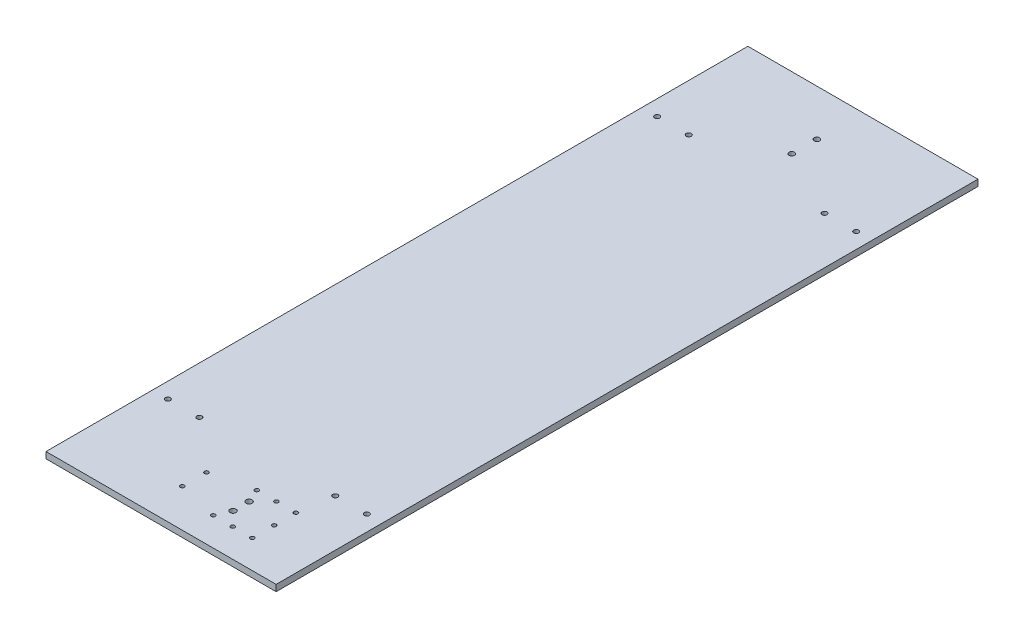
ISO-10303-21;
HEADER;
FILE_DESCRIPTION(('STEP AP214'),'2;1');
FILE_NAME('part.step','',(''),(''),'','','');
FILE_SCHEMA(('AUTOMOTIVE_DESIGN { 1 0 10303 214 1 1 1 1 }'));
ENDSEC;
DATA;
#1=APPLICATION_CONTEXT('core data for automotive mechanical design processes');
#2=APPLICATION_PROTOCOL_DEFINITION('international standard','automotive_design',2000,#1);
#3=PRODUCT_CONTEXT('',#1,'mechanical');
#4=PRODUCT('Part','Part','',(#3));
#5=PRODUCT_RELATED_PRODUCT_CATEGORY('part','',(#4));
#6=PRODUCT_DEFINITION_FORMATION('','',#4);
#7=PRODUCT_DEFINITION_CONTEXT('part definition',#1,'design');
#8=PRODUCT_DEFINITION('design','',#6,#7);
#9=PRODUCT_DEFINITION_SHAPE('','',#8);
#10=(LENGTH_UNIT() NAMED_UNIT(*) SI_UNIT(.MILLI.,.METRE.));
#11=(NAMED_UNIT(*) PLANE_ANGLE_UNIT() SI_UNIT($,.RADIAN.));
#12=(NAMED_UNIT(*) SI_UNIT($,.STERADIAN.) SOLID_ANGLE_UNIT());
#13=UNCERTAINTY_MEASURE_WITH_UNIT(LENGTH_MEASURE(1.E-05),#10,'distance_accuracy_value','');
#14=(GEOMETRIC_REPRESENTATION_CONTEXT(3) GLOBAL_UNCERTAINTY_ASSIGNED_CONTEXT((#13)) GLOBAL_UNIT_ASSIGNED_CONTEXT((#10,
#11,#12)) REPRESENTATION_CONTEXT('',''));
#15=CARTESIAN_POINT('',(0.,0.,0.));
#16=DIRECTION('',(0.,0.,1.));
#17=DIRECTION('',(1.,0.,0.));
#18=AXIS2_PLACEMENT_3D('',#15,#16,#17);
#19=CARTESIAN_POINT('',(-114.75,6.35,-350.));
#20=DIRECTION('',(1.,0.,0.));
#21=DIRECTION('',(0.,0.,-1.));
#22=AXIS2_PLACEMENT_3D('',#19,#20,#21);
#23=PLANE('',#22);
#24=DIRECTION('',(0.,0.,1.));
#25=VECTOR('',#24,1.);
#26=CARTESIAN_POINT('',(-114.75,0.,-350.));
#27=LINE('',#26,#25);
#28=CARTESIAN_POINT('',(-114.75,0.,-350.));
#29=VERTEX_POINT('',#28);
#30=CARTESIAN_POINT('',(-114.75,0.,350.));
#31=VERTEX_POINT('',#30);
#32=EDGE_CURVE('E97',#29,#31,#27,.T.);
#33=ORIENTED_EDGE('',*,*,#32,.T.);
#34=DIRECTION('',(0.,-1.,0.));
#35=VECTOR('',#34,1.);
#36=CARTESIAN_POINT('',(-114.75,6.35,350.));
#37=LINE('',#36,#35);
#38=CARTESIAN_POINT('',(-114.75,6.35,350.));
#39=VERTEX_POINT('',#38);
#40=EDGE_CURVE('E11',#39,#31,#37,.T.);
#41=ORIENTED_EDGE('',*,*,#40,.F.);
#42=DIRECTION('',(0.,0.,1.));
#43=VECTOR('',#42,1.);
#44=CARTESIAN_POINT('',(-114.75,6.35,-350.));
#45=LINE('',#44,#43);
#46=CARTESIAN_POINT('',(-114.75,6.35,-350.));
#47=VERTEX_POINT('',#46);
#48=EDGE_CURVE('E85',#47,#39,#45,.T.);
#49=ORIENTED_EDGE('',*,*,#48,.F.);
#50=DIRECTION('',(0.,-1.,0.));
#51=VECTOR('',#50,1.);
#52=CARTESIAN_POINT('',(-114.75,6.35,-350.));
#53=LINE('',#52,#51);
#54=EDGE_CURVE('E93',#47,#29,#53,.T.);
#55=ORIENTED_EDGE('',*,*,#54,.T.);
#56=EDGE_LOOP('',(#33,#41,#49,#55));
#57=FACE_BOUND('',#56,.T.);
#58=ADVANCED_FACE('F34',(#57),#23,.F.);
#59=CARTESIAN_POINT('',(114.75,6.35,350.));
#60=DIRECTION('',(0.,0.,-1.));
#61=DIRECTION('',(-1.,0.,0.));
#62=AXIS2_PLACEMENT_3D('',#59,#60,#61);
#63=PLANE('',#62);
#64=DIRECTION('',(1.,0.,0.));
#65=VECTOR('',#64,1.);
#66=CARTESIAN_POINT('',(114.75,0.,350.));
#67=LINE('',#66,#65);
#68=CARTESIAN_POINT('',(114.75,0.,350.));
#69=VERTEX_POINT('',#68);
#70=EDGE_CURVE('E89',#31,#69,#67,.T.);
#71=ORIENTED_EDGE('',*,*,#70,.T.);
#72=DIRECTION('',(0.,-1.,0.));
#73=VECTOR('',#72,1.);
#74=CARTESIAN_POINT('',(114.75,6.35,350.));
#75=LINE('',#74,#73);
#76=CARTESIAN_POINT('',(114.75,6.35,350.));
#77=VERTEX_POINT('',#76);
#78=EDGE_CURVE('E42',#77,#69,#75,.T.);
#79=ORIENTED_EDGE('',*,*,#78,.F.);
#80=DIRECTION('',(1.,0.,0.));
#81=VECTOR('',#80,1.);
#82=CARTESIAN_POINT('',(114.75,6.35,350.));
#83=LINE('',#82,#81);
#84=EDGE_CURVE('E80',#39,#77,#83,.T.);
#85=ORIENTED_EDGE('',*,*,#84,.F.);
#86=ORIENTED_EDGE('',*,*,#40,.T.);
#87=EDGE_LOOP('',(#71,#79,#85,#86));
#88=FACE_BOUND('',#87,.T.);
#89=ADVANCED_FACE('F88',(#88),#63,.F.);
#90=CARTESIAN_POINT('',(114.75,6.35,-350.));
#91=DIRECTION('',(-1.,0.,0.));
#92=DIRECTION('',(0.,0.,1.));
#93=AXIS2_PLACEMENT_3D('',#90,#91,#92);
#94=PLANE('',#93);
#95=DIRECTION('',(0.,0.,-1.));
#96=VECTOR('',#95,1.);
#97=CARTESIAN_POINT('',(114.75,0.,-350.));
#98=LINE('',#97,#96);
#99=CARTESIAN_POINT('',(114.75,0.,-350.));
#100=VERTEX_POINT('',#99);
#101=EDGE_CURVE('E67',#69,#100,#98,.T.);
#102=ORIENTED_EDGE('',*,*,#101,.T.);
#103=DIRECTION('',(0.,-1.,0.));
#104=VECTOR('',#103,1.);
#105=CARTESIAN_POINT('',(114.75,6.35,-350.));
#106=LINE('',#105,#104);
#107=CARTESIAN_POINT('',(114.75,6.35,-350.));
#108=VERTEX_POINT('',#107);
#109=EDGE_CURVE('E90',#108,#100,#106,.T.);
#110=ORIENTED_EDGE('',*,*,#109,.F.);
#111=DIRECTION('',(0.,0.,-1.));
#112=VECTOR('',#111,1.);
#113=CARTESIAN_POINT('',(114.75,6.35,-350.));
#114=LINE('',#113,#112);
#115=EDGE_CURVE('E83',#77,#108,#114,.T.);
#116=ORIENTED_EDGE('',*,*,#115,.F.);
#117=ORIENTED_EDGE('',*,*,#78,.T.);
#118=EDGE_LOOP('',(#102,#110,#116,#117));
#119=FACE_BOUND('',#118,.T.);
#120=ADVANCED_FACE('F91',(#119),#94,.F.);
#121=CARTESIAN_POINT('',(114.75,6.35,-350.));
#122=DIRECTION('',(0.,0.,1.));
#123=DIRECTION('',(1.,0.,0.));
#124=AXIS2_PLACEMENT_3D('',#121,#122,#123);
#125=PLANE('',#124);
#126=DIRECTION('',(-1.,0.,0.));
#127=VECTOR('',#126,1.);
#128=CARTESIAN_POINT('',(114.75,0.,-350.));
#129=LINE('',#128,#127);
#130=EDGE_CURVE('E73',#100,#29,#129,.T.);
#131=ORIENTED_EDGE('',*,*,#130,.T.);
#132=ORIENTED_EDGE('',*,*,#54,.F.);
#133=DIRECTION('',(-1.,0.,0.));
#134=VECTOR('',#133,1.);
#135=CARTESIAN_POINT('',(114.75,6.35,-350.));
#136=LINE('',#135,#134);
#137=EDGE_CURVE('E50',#108,#47,#136,.T.);
#138=ORIENTED_EDGE('',*,*,#137,.F.);
#139=ORIENTED_EDGE('',*,*,#109,.T.);
#140=EDGE_LOOP('',(#131,#132,#138,#139));
#141=FACE_BOUND('',#140,.T.);
#142=ADVANCED_FACE('F105',(#141),#125,.F.);
#143=CARTESIAN_POINT('',(0.,6.35,0.));
#144=DIRECTION('',(0.,-1.,0.));
#145=DIRECTION('',(0.,0.,-1.));
#146=AXIS2_PLACEMENT_3D('',#143,#144,#145);
#147=PLANE('',#146);
#148=CARTESIAN_POINT('',(0.,6.35,-279.));
#149=DIRECTION('',(0.,1.,0.));
#150=DIRECTION('',(0.,0.,1.));
#151=AXIS2_PLACEMENT_3D('',#148,#149,#150);
#152=CIRCLE('',#151,2.75);
#153=CARTESIAN_POINT('',(0.,6.35,-276.25));
#154=VERTEX_POINT('',#153);
#155=EDGE_CURVE('E231',#154,#154,#152,.T.);
#156=ORIENTED_EDGE('',*,*,#155,.F.);
#157=EDGE_LOOP('',(#156));
#158=FACE_BOUND('',#157,.T.);
#159=CARTESIAN_POINT('',(0.,6.35,-304.));
#160=DIRECTION('',(0.,1.,0.));
#161=DIRECTION('',(0.,0.,1.));
#162=AXIS2_PLACEMENT_3D('',#159,#160,#161);
#163=CIRCLE('',#162,2.75);
#164=CARTESIAN_POINT('',(0.,6.35,-301.25));
#165=VERTEX_POINT('',#164);
#166=EDGE_CURVE('E225',#165,#165,#163,.T.);
#167=ORIENTED_EDGE('',*,*,#166,.F.);
#168=EDGE_LOOP('',(#167));
#169=FACE_BOUND('',#168,.T.);
#170=CARTESIAN_POINT('',(-67.7499999999988,6.35,-244.));
#171=DIRECTION('',(0.,-1.,0.));
#172=DIRECTION('',(0.,0.,-1.));
#173=AXIS2_PLACEMENT_3D('',#170,#171,#172);
#174=CIRCLE('',#173,2.5);
#175=CARTESIAN_POINT('',(-67.7499999999988,6.35,-246.5));
#176=VERTEX_POINT('',#175);
#177=EDGE_CURVE('E168',#176,#176,#174,.T.);
#178=ORIENTED_EDGE('',*,*,#177,.T.);
#179=EDGE_LOOP('',(#178));
#180=FACE_BOUND('',#179,.T.);
#181=CARTESIAN_POINT('',(-99.2499999999988,6.35,-244.));
#182=DIRECTION('',(0.,-1.,0.));
#183=DIRECTION('',(0.,0.,-1.));
#184=AXIS2_PLACEMENT_3D('',#181,#182,#183);
#185=CIRCLE('',#184,2.50000000000001);
#186=CARTESIAN_POINT('',(-99.2499999999988,6.35,-246.5));
#187=VERTEX_POINT('',#186);
#188=EDGE_CURVE('E175',#187,#187,#185,.T.);
#189=ORIENTED_EDGE('',*,*,#188,.T.);
#190=EDGE_LOOP('',(#189));
#191=FACE_BOUND('',#190,.T.);
#192=CARTESIAN_POINT('',(99.2499999999988,6.35,-244.));
#193=DIRECTION('',(0.,-1.,0.));
#194=DIRECTION('',(0.,0.,1.));
#195=AXIS2_PLACEMENT_3D('',#192,#193,#194);
#196=CIRCLE('',#195,2.50000000000001);
#197=CARTESIAN_POINT('',(99.2499999999988,6.35,-241.5));
#198=VERTEX_POINT('',#197);
#199=EDGE_CURVE('E181',#198,#198,#196,.T.);
#200=ORIENTED_EDGE('',*,*,#199,.T.);
#201=EDGE_LOOP('',(#200));
#202=FACE_BOUND('',#201,.T.);
#203=CARTESIAN_POINT('',(67.7499999999988,6.35,-244.));
#204=DIRECTION('',(0.,-1.,0.));
#205=DIRECTION('',(0.,0.,1.));
#206=AXIS2_PLACEMENT_3D('',#203,#204,#205);
#207=CIRCLE('',#206,2.5);
#208=CARTESIAN_POINT('',(67.7499999999988,6.35,-241.5));
#209=VERTEX_POINT('',#208);
#210=EDGE_CURVE('E187',#209,#209,#207,.T.);
#211=ORIENTED_EDGE('',*,*,#210,.T.);
#212=EDGE_LOOP('',(#211));
#213=FACE_BOUND('',#212,.T.);
#214=CARTESIAN_POINT('',(99.2499999999988,6.35,244.));
#215=DIRECTION('',(0.,-1.,0.));
#216=DIRECTION('',(0.,0.,-1.));
#217=AXIS2_PLACEMENT_3D('',#214,#215,#216);
#218=CIRCLE('',#217,2.50000000000001);
#219=CARTESIAN_POINT('',(99.2499999999988,6.35,241.5));
#220=VERTEX_POINT('',#219);
#221=EDGE_CURVE('E193',#220,#220,#218,.T.);
#222=ORIENTED_EDGE('',*,*,#221,.T.);
#223=EDGE_LOOP('',(#222));
#224=FACE_BOUND('',#223,.T.);
#225=CARTESIAN_POINT('',(67.7499999999988,6.35,244.));
#226=DIRECTION('',(0.,-1.,0.));
#227=DIRECTION('',(0.,0.,-1.));
#228=AXIS2_PLACEMENT_3D('',#225,#226,#227);
#229=CIRCLE('',#228,2.5);
#230=CARTESIAN_POINT('',(67.7499999999988,6.35,241.5));
#231=VERTEX_POINT('',#230);
#232=EDGE_CURVE('E199',#231,#231,#229,.T.);
#233=ORIENTED_EDGE('',*,*,#232,.T.);
#234=EDGE_LOOP('',(#233));
#235=FACE_BOUND('',#234,.T.);
#236=CARTESIAN_POINT('',(29.75,6.35,308.));
#237=DIRECTION('',(0.,-1.,0.));
#238=DIRECTION('',(0.,0.,-1.));
#239=AXIS2_PLACEMENT_3D('',#236,#237,#238);
#240=CIRCLE('',#239,3.);
#241=CARTESIAN_POINT('',(29.75,6.35,305.));
#242=VERTEX_POINT('',#241);
#243=EDGE_CURVE('E205',#242,#242,#240,.T.);
#244=ORIENTED_EDGE('',*,*,#243,.T.);
#245=EDGE_LOOP('',(#244));
#246=FACE_BOUND('',#245,.T.);
#247=CARTESIAN_POINT('',(29.75,6.35,292.));
#248=DIRECTION('',(0.,-1.,0.));
#249=DIRECTION('',(0.,0.,-1.));
#250=AXIS2_PLACEMENT_3D('',#247,#248,#249);
#251=CIRCLE('',#250,3.00000000000001);
#252=CARTESIAN_POINT('',(29.75,6.35,289.));
#253=VERTEX_POINT('',#252);
#254=EDGE_CURVE('E145',#253,#253,#251,.T.);
#255=ORIENTED_EDGE('',*,*,#254,.T.);
#256=EDGE_LOOP('',(#255));
#257=FACE_BOUND('',#256,.T.);
#258=CARTESIAN_POINT('',(-16.75,6.35,288.));
#259=DIRECTION('',(0.,-1.,0.));
#260=DIRECTION('',(0.,0.,-1.));
#261=AXIS2_PLACEMENT_3D('',#258,#259,#260);
#262=CIRCLE('',#261,2.);
#263=CARTESIAN_POINT('',(-16.75,6.35,286.));
#264=VERTEX_POINT('',#263);
#265=EDGE_CURVE('E114',#264,#264,#262,.T.);
#266=ORIENTED_EDGE('',*,*,#265,.T.);
#267=EDGE_LOOP('',(#266));
#268=FACE_BOUND('',#267,.T.);
#269=CARTESIAN_POINT('',(23.75,6.35,321.75));
#270=DIRECTION('',(0.,-1.,0.));
#271=DIRECTION('',(0.,0.,-1.));
#272=AXIS2_PLACEMENT_3D('',#269,#270,#271);
#273=CIRCLE('',#272,2.);
#274=CARTESIAN_POINT('',(23.75,6.35,319.75));
#275=VERTEX_POINT('',#274);
#276=EDGE_CURVE('E133',#275,#275,#273,.T.);
#277=ORIENTED_EDGE('',*,*,#276,.T.);
#278=EDGE_LOOP('',(#277));
#279=FACE_BOUND('',#278,.T.);
#280=CARTESIAN_POINT('',(23.75,6.35,278.25));
#281=DIRECTION('',(0.,-1.,0.));
#282=DIRECTION('',(0.,0.,-1.));
#283=AXIS2_PLACEMENT_3D('',#280,#281,#282);
#284=CIRCLE('',#283,2.);
#285=CARTESIAN_POINT('',(23.75,6.35,276.25));
#286=VERTEX_POINT('',#285);
#287=EDGE_CURVE('E127',#286,#286,#284,.T.);
#288=ORIENTED_EDGE('',*,*,#287,.T.);
#289=EDGE_LOOP('',(#288));
#290=FACE_BOUND('',#289,.T.);
#291=CARTESIAN_POINT('',(43.25,6.35,278.25));
#292=DIRECTION('',(0.,-1.,0.));
#293=DIRECTION('',(0.,0.,-1.));
#294=AXIS2_PLACEMENT_3D('',#291,#292,#293);
#295=CIRCLE('',#294,2.00000000000002);
#296=CARTESIAN_POINT('',(43.25,6.35,276.25));
#297=VERTEX_POINT('',#296);
#298=EDGE_CURVE('E120',#297,#297,#295,.T.);
#299=ORIENTED_EDGE('',*,*,#298,.T.);
#300=EDGE_LOOP('',(#299));
#301=FACE_BOUND('',#300,.T.);
#302=CARTESIAN_POINT('',(43.25,6.35,321.75));
#303=DIRECTION('',(0.,-1.,0.));
#304=DIRECTION('',(0.,0.,-1.));
#305=AXIS2_PLACEMENT_3D('',#302,#303,#304);
#306=CIRCLE('',#305,2.);
#307=CARTESIAN_POINT('',(43.25,6.35,319.75));
#308=VERTEX_POINT('',#307);
#309=EDGE_CURVE('E121',#308,#308,#306,.T.);
#310=ORIENTED_EDGE('',*,*,#309,.T.);
#311=EDGE_LOOP('',(#310));
#312=FACE_BOUND('',#311,.T.);
#313=CARTESIAN_POINT('',(62.75,6.35,321.75));
#314=DIRECTION('',(0.,-1.,0.));
#315=DIRECTION('',(0.,0.,-1.));
#316=AXIS2_PLACEMENT_3D('',#313,#314,#315);
#317=CIRCLE('',#316,1.99999999999998);
#318=CARTESIAN_POINT('',(62.75,6.35,319.75));
#319=VERTEX_POINT('',#318);
#320=EDGE_CURVE('E157',#319,#319,#317,.T.);
#321=ORIENTED_EDGE('',*,*,#320,.T.);
#322=EDGE_LOOP('',(#321));
#323=FACE_BOUND('',#322,.T.);
#324=CARTESIAN_POINT('',(62.75,6.35,300.));
#325=DIRECTION('',(0.,-1.,0.));
#326=DIRECTION('',(0.,0.,-1.));
#327=AXIS2_PLACEMENT_3D('',#324,#325,#326);
#328=CIRCLE('',#327,2.00000000000001);
#329=CARTESIAN_POINT('',(62.75,6.35,298.));
#330=VERTEX_POINT('',#329);
#331=EDGE_CURVE('E151',#330,#330,#328,.T.);
#332=ORIENTED_EDGE('',*,*,#331,.T.);
#333=EDGE_LOOP('',(#332));
#334=FACE_BOUND('',#333,.T.);
#335=CARTESIAN_POINT('',(62.75,6.35,278.25));
#336=DIRECTION('',(0.,-1.,0.));
#337=DIRECTION('',(0.,0.,-1.));
#338=AXIS2_PLACEMENT_3D('',#335,#336,#337);
#339=CIRCLE('',#338,2.);
#340=CARTESIAN_POINT('',(62.75,6.35,276.25));
#341=VERTEX_POINT('',#340);
#342=EDGE_CURVE('E144',#341,#341,#339,.T.);
#343=ORIENTED_EDGE('',*,*,#342,.T.);
#344=EDGE_LOOP('',(#343));
#345=FACE_BOUND('',#344,.T.);
#346=CARTESIAN_POINT('',(-99.2499999999988,6.35,244.));
#347=DIRECTION('',(0.,-1.,0.));
#348=DIRECTION('',(0.,0.,1.));
#349=AXIS2_PLACEMENT_3D('',#346,#347,#348);
#350=CIRCLE('',#349,2.50000000000001);
#351=CARTESIAN_POINT('',(-99.2499999999988,6.35,246.5));
#352=VERTEX_POINT('',#351);
#353=EDGE_CURVE('E169',#352,#352,#350,.T.);
#354=ORIENTED_EDGE('',*,*,#353,.T.);
#355=EDGE_LOOP('',(#354));
#356=FACE_BOUND('',#355,.T.);
#357=CARTESIAN_POINT('',(-67.7499999999988,6.35,244.));
#358=DIRECTION('',(0.,-1.,0.));
#359=DIRECTION('',(0.,0.,1.));
#360=AXIS2_PLACEMENT_3D('',#357,#358,#359);
#361=CIRCLE('',#360,2.5);
#362=CARTESIAN_POINT('',(-67.7499999999988,6.35,246.5));
#363=VERTEX_POINT('',#362);
#364=EDGE_CURVE('E216',#363,#363,#361,.T.);
#365=ORIENTED_EDGE('',*,*,#364,.T.);
#366=EDGE_LOOP('',(#365));
#367=FACE_BOUND('',#366,.T.);
#368=CARTESIAN_POINT('',(-16.75,6.35,312.));
#369=DIRECTION('',(0.,-1.,0.));
#370=DIRECTION('',(0.,0.,-1.));
#371=AXIS2_PLACEMENT_3D('',#368,#369,#370);
#372=CIRCLE('',#371,2.);
#373=CARTESIAN_POINT('',(-16.75,6.35,310.));
#374=VERTEX_POINT('',#373);
#375=EDGE_CURVE('E100',#374,#374,#372,.T.);
#376=ORIENTED_EDGE('',*,*,#375,.T.);
#377=EDGE_LOOP('',(#376));
#378=FACE_BOUND('',#377,.T.);
#379=ORIENTED_EDGE('',*,*,#48,.T.);
#380=ORIENTED_EDGE('',*,*,#84,.T.);
#381=ORIENTED_EDGE('',*,*,#115,.T.);
#382=ORIENTED_EDGE('',*,*,#137,.T.);
#383=EDGE_LOOP('',(#379,#380,#381,#382));
#384=FACE_BOUND('',#383,.T.);
#385=ADVANCED_FACE('F81',(#158,#169,#180,#191,#202,#213,#224,#235,#246,#257,#268,#279,#290,#301,
#312,#323,#334,#345,#356,#367,#378,#384),#147,.F.);
#386=CARTESIAN_POINT('',(0.,0.,0.));
#387=DIRECTION('',(0.,-1.,0.));
#388=DIRECTION('',(0.,0.,-1.));
#389=AXIS2_PLACEMENT_3D('',#386,#387,#388);
#390=PLANE('',#389);
#391=CARTESIAN_POINT('',(0.,0.,-279.));
#392=DIRECTION('',(0.,1.,0.));
#393=DIRECTION('',(0.,0.,1.));
#394=AXIS2_PLACEMENT_3D('',#391,#392,#393);
#395=CIRCLE('',#394,2.75);
#396=CARTESIAN_POINT('',(0.,0.,-276.25));
#397=VERTEX_POINT('',#396);
#398=EDGE_CURVE('E217',#397,#397,#395,.T.);
#399=ORIENTED_EDGE('',*,*,#398,.T.);
#400=EDGE_LOOP('',(#399));
#401=FACE_BOUND('',#400,.T.);
#402=CARTESIAN_POINT('',(0.,0.,-304.));
#403=DIRECTION('',(0.,1.,0.));
#404=DIRECTION('',(0.,0.,1.));
#405=AXIS2_PLACEMENT_3D('',#402,#403,#404);
#406=CIRCLE('',#405,2.75);
#407=CARTESIAN_POINT('',(0.,0.,-301.25));
#408=VERTEX_POINT('',#407);
#409=EDGE_CURVE('E228',#408,#408,#406,.T.);
#410=ORIENTED_EDGE('',*,*,#409,.T.);
#411=EDGE_LOOP('',(#410));
#412=FACE_BOUND('',#411,.T.);
#413=CARTESIAN_POINT('',(-67.7499999999988,0.,-244.));
#414=DIRECTION('',(0.,-1.,0.));
#415=DIRECTION('',(0.,0.,-1.));
#416=AXIS2_PLACEMENT_3D('',#413,#414,#415);
#417=CIRCLE('',#416,2.5);
#418=CARTESIAN_POINT('',(-67.7499999999988,0.,-246.5));
#419=VERTEX_POINT('',#418);
#420=EDGE_CURVE('E165',#419,#419,#417,.T.);
#421=ORIENTED_EDGE('',*,*,#420,.F.);
#422=EDGE_LOOP('',(#421));
#423=FACE_BOUND('',#422,.T.);
#424=CARTESIAN_POINT('',(-99.2499999999988,0.,-244.));
#425=DIRECTION('',(0.,-1.,0.));
#426=DIRECTION('',(0.,0.,-1.));
#427=AXIS2_PLACEMENT_3D('',#424,#425,#426);
#428=CIRCLE('',#427,2.50000000000001);
#429=CARTESIAN_POINT('',(-99.2499999999988,0.,-246.5));
#430=VERTEX_POINT('',#429);
#431=EDGE_CURVE('E172',#430,#430,#428,.T.);
#432=ORIENTED_EDGE('',*,*,#431,.F.);
#433=EDGE_LOOP('',(#432));
#434=FACE_BOUND('',#433,.T.);
#435=CARTESIAN_POINT('',(99.2499999999988,0.,-244.));
#436=DIRECTION('',(0.,-1.,0.));
#437=DIRECTION('',(0.,0.,1.));
#438=AXIS2_PLACEMENT_3D('',#435,#436,#437);
#439=CIRCLE('',#438,2.50000000000001);
#440=CARTESIAN_POINT('',(99.2499999999988,0.,-241.5));
#441=VERTEX_POINT('',#440);
#442=EDGE_CURVE('E178',#441,#441,#439,.T.);
#443=ORIENTED_EDGE('',*,*,#442,.F.);
#444=EDGE_LOOP('',(#443));
#445=FACE_BOUND('',#444,.T.);
#446=CARTESIAN_POINT('',(67.7499999999988,0.,-244.));
#447=DIRECTION('',(0.,-1.,0.));
#448=DIRECTION('',(0.,0.,1.));
#449=AXIS2_PLACEMENT_3D('',#446,#447,#448);
#450=CIRCLE('',#449,2.5);
#451=CARTESIAN_POINT('',(67.7499999999988,0.,-241.5));
#452=VERTEX_POINT('',#451);
#453=EDGE_CURVE('E184',#452,#452,#450,.T.);
#454=ORIENTED_EDGE('',*,*,#453,.F.);
#455=EDGE_LOOP('',(#454));
#456=FACE_BOUND('',#455,.T.);
#457=CARTESIAN_POINT('',(99.2499999999988,0.,244.));
#458=DIRECTION('',(0.,-1.,0.));
#459=DIRECTION('',(0.,0.,-1.));
#460=AXIS2_PLACEMENT_3D('',#457,#458,#459);
#461=CIRCLE('',#460,2.50000000000001);
#462=CARTESIAN_POINT('',(99.2499999999988,0.,241.5));
#463=VERTEX_POINT('',#462);
#464=EDGE_CURVE('E190',#463,#463,#461,.T.);
#465=ORIENTED_EDGE('',*,*,#464,.F.);
#466=EDGE_LOOP('',(#465));
#467=FACE_BOUND('',#466,.T.);
#468=CARTESIAN_POINT('',(67.7499999999988,0.,244.));
#469=DIRECTION('',(0.,-1.,0.));
#470=DIRECTION('',(0.,0.,-1.));
#471=AXIS2_PLACEMENT_3D('',#468,#469,#470);
#472=CIRCLE('',#471,2.5);
#473=CARTESIAN_POINT('',(67.7499999999988,0.,241.5));
#474=VERTEX_POINT('',#473);
#475=EDGE_CURVE('E196',#474,#474,#472,.T.);
#476=ORIENTED_EDGE('',*,*,#475,.F.);
#477=EDGE_LOOP('',(#476));
#478=FACE_BOUND('',#477,.T.);
#479=CARTESIAN_POINT('',(29.75,0.,308.));
#480=DIRECTION('',(0.,-1.,0.));
#481=DIRECTION('',(0.,0.,-1.));
#482=AXIS2_PLACEMENT_3D('',#479,#480,#481);
#483=CIRCLE('',#482,3.);
#484=CARTESIAN_POINT('',(29.75,0.,305.));
#485=VERTEX_POINT('',#484);
#486=EDGE_CURVE('E202',#485,#485,#483,.T.);
#487=ORIENTED_EDGE('',*,*,#486,.F.);
#488=EDGE_LOOP('',(#487));
#489=FACE_BOUND('',#488,.T.);
#490=CARTESIAN_POINT('',(29.75,0.,292.));
#491=DIRECTION('',(0.,-1.,0.));
#492=DIRECTION('',(0.,0.,-1.));
#493=AXIS2_PLACEMENT_3D('',#490,#491,#492);
#494=CIRCLE('',#493,3.00000000000001);
#495=CARTESIAN_POINT('',(29.75,0.,289.));
#496=VERTEX_POINT('',#495);
#497=EDGE_CURVE('E208',#496,#496,#494,.T.);
#498=ORIENTED_EDGE('',*,*,#497,.F.);
#499=EDGE_LOOP('',(#498));
#500=FACE_BOUND('',#499,.T.);
#501=CARTESIAN_POINT('',(-16.75,0.,288.));
#502=DIRECTION('',(0.,-1.,0.));
#503=DIRECTION('',(0.,0.,-1.));
#504=AXIS2_PLACEMENT_3D('',#501,#502,#503);
#505=CIRCLE('',#504,2.);
#506=CARTESIAN_POINT('',(-16.75,0.,286.));
#507=VERTEX_POINT('',#506);
#508=EDGE_CURVE('E136',#507,#507,#505,.T.);
#509=ORIENTED_EDGE('',*,*,#508,.F.);
#510=EDGE_LOOP('',(#509));
#511=FACE_BOUND('',#510,.T.);
#512=CARTESIAN_POINT('',(23.75,0.,321.75));
#513=DIRECTION('',(0.,-1.,0.));
#514=DIRECTION('',(0.,0.,-1.));
#515=AXIS2_PLACEMENT_3D('',#512,#513,#514);
#516=CIRCLE('',#515,2.);
#517=CARTESIAN_POINT('',(23.75,0.,319.75));
#518=VERTEX_POINT('',#517);
#519=EDGE_CURVE('E130',#518,#518,#516,.T.);
#520=ORIENTED_EDGE('',*,*,#519,.F.);
#521=EDGE_LOOP('',(#520));
#522=FACE_BOUND('',#521,.T.);
#523=CARTESIAN_POINT('',(23.75,0.,278.25));
#524=DIRECTION('',(0.,-1.,0.));
#525=DIRECTION('',(0.,0.,-1.));
#526=AXIS2_PLACEMENT_3D('',#523,#524,#525);
#527=CIRCLE('',#526,2.);
#528=CARTESIAN_POINT('',(23.75,0.,276.25));
#529=VERTEX_POINT('',#528);
#530=EDGE_CURVE('E124',#529,#529,#527,.T.);
#531=ORIENTED_EDGE('',*,*,#530,.F.);
#532=EDGE_LOOP('',(#531));
#533=FACE_BOUND('',#532,.T.);
#534=CARTESIAN_POINT('',(43.25,0.,278.25));
#535=DIRECTION('',(0.,-1.,0.));
#536=DIRECTION('',(0.,0.,-1.));
#537=AXIS2_PLACEMENT_3D('',#534,#535,#536);
#538=CIRCLE('',#537,2.00000000000002);
#539=CARTESIAN_POINT('',(43.25,0.,276.25));
#540=VERTEX_POINT('',#539);
#541=EDGE_CURVE('E117',#540,#540,#538,.T.);
#542=ORIENTED_EDGE('',*,*,#541,.F.);
#543=EDGE_LOOP('',(#542));
#544=FACE_BOUND('',#543,.T.);
#545=CARTESIAN_POINT('',(43.25,0.,321.75));
#546=DIRECTION('',(0.,-1.,0.));
#547=DIRECTION('',(0.,0.,-1.));
#548=AXIS2_PLACEMENT_3D('',#545,#546,#547);
#549=CIRCLE('',#548,2.);
#550=CARTESIAN_POINT('',(43.25,0.,319.75));
#551=VERTEX_POINT('',#550);
#552=EDGE_CURVE('E160',#551,#551,#549,.T.);
#553=ORIENTED_EDGE('',*,*,#552,.F.);
#554=EDGE_LOOP('',(#553));
#555=FACE_BOUND('',#554,.T.);
#556=CARTESIAN_POINT('',(62.75,0.,321.75));
#557=DIRECTION('',(0.,-1.,0.));
#558=DIRECTION('',(0.,0.,-1.));
#559=AXIS2_PLACEMENT_3D('',#556,#557,#558);
#560=CIRCLE('',#559,1.99999999999998);
#561=CARTESIAN_POINT('',(62.75,0.,319.75));
#562=VERTEX_POINT('',#561);
#563=EDGE_CURVE('E154',#562,#562,#560,.T.);
#564=ORIENTED_EDGE('',*,*,#563,.F.);
#565=EDGE_LOOP('',(#564));
#566=FACE_BOUND('',#565,.T.);
#567=CARTESIAN_POINT('',(62.75,0.,300.));
#568=DIRECTION('',(0.,-1.,0.));
#569=DIRECTION('',(0.,0.,-1.));
#570=AXIS2_PLACEMENT_3D('',#567,#568,#569);
#571=CIRCLE('',#570,2.00000000000001);
#572=CARTESIAN_POINT('',(62.75,0.,298.));
#573=VERTEX_POINT('',#572);
#574=EDGE_CURVE('E148',#573,#573,#571,.T.);
#575=ORIENTED_EDGE('',*,*,#574,.F.);
#576=EDGE_LOOP('',(#575));
#577=FACE_BOUND('',#576,.T.);
#578=CARTESIAN_POINT('',(62.75,0.,278.25));
#579=DIRECTION('',(0.,-1.,0.));
#580=DIRECTION('',(0.,0.,-1.));
#581=AXIS2_PLACEMENT_3D('',#578,#579,#580);
#582=CIRCLE('',#581,2.);
#583=CARTESIAN_POINT('',(62.75,0.,276.25));
#584=VERTEX_POINT('',#583);
#585=EDGE_CURVE('E141',#584,#584,#582,.T.);
#586=ORIENTED_EDGE('',*,*,#585,.F.);
#587=EDGE_LOOP('',(#586));
#588=FACE_BOUND('',#587,.T.);
#589=CARTESIAN_POINT('',(-99.2499999999988,0.,244.));
#590=DIRECTION('',(0.,-1.,0.));
#591=DIRECTION('',(0.,0.,1.));
#592=AXIS2_PLACEMENT_3D('',#589,#590,#591);
#593=CIRCLE('',#592,2.50000000000001);
#594=CARTESIAN_POINT('',(-99.2499999999988,0.,246.5));
#595=VERTEX_POINT('',#594);
#596=EDGE_CURVE('E220',#595,#595,#593,.T.);
#597=ORIENTED_EDGE('',*,*,#596,.F.);
#598=EDGE_LOOP('',(#597));
#599=FACE_BOUND('',#598,.T.);
#600=CARTESIAN_POINT('',(-67.7499999999988,0.,244.));
#601=DIRECTION('',(0.,-1.,0.));
#602=DIRECTION('',(0.,0.,1.));
#603=AXIS2_PLACEMENT_3D('',#600,#601,#602);
#604=CIRCLE('',#603,2.5);
#605=CARTESIAN_POINT('',(-67.7499999999988,0.,246.5));
#606=VERTEX_POINT('',#605);
#607=EDGE_CURVE('E213',#606,#606,#604,.T.);
#608=ORIENTED_EDGE('',*,*,#607,.F.);
#609=EDGE_LOOP('',(#608));
#610=FACE_BOUND('',#609,.T.);
#611=CARTESIAN_POINT('',(-16.75,0.,312.));
#612=DIRECTION('',(0.,-1.,0.));
#613=DIRECTION('',(0.,0.,-1.));
#614=AXIS2_PLACEMENT_3D('',#611,#612,#613);
#615=CIRCLE('',#614,2.);
#616=CARTESIAN_POINT('',(-16.75,0.,310.));
#617=VERTEX_POINT('',#616);
#618=EDGE_CURVE('E111',#617,#617,#615,.T.);
#619=ORIENTED_EDGE('',*,*,#618,.F.);
#620=EDGE_LOOP('',(#619));
#621=FACE_BOUND('',#620,.T.);
#622=ORIENTED_EDGE('',*,*,#32,.F.);
#623=ORIENTED_EDGE('',*,*,#130,.F.);
#624=ORIENTED_EDGE('',*,*,#101,.F.);
#625=ORIENTED_EDGE('',*,*,#70,.F.);
#626=EDGE_LOOP('',(#622,#623,#624,#625));
#627=FACE_BOUND('',#626,.T.);
#628=ADVANCED_FACE('F108',(#401,#412,#423,#434,#445,#456,#467,#478,#489,#500,#511,#522,#533,
#544,#555,#566,#577,#588,#599,#610,#621,#627),#390,.T.);
#629=CARTESIAN_POINT('',(-16.75,6.35,312.));
#630=DIRECTION('',(0.,-1.,0.));
#631=DIRECTION('',(0.,0.,-1.));
#632=AXIS2_PLACEMENT_3D('',#629,#630,#631);
#633=CYLINDRICAL_SURFACE('',#632,2.);
#634=ORIENTED_EDGE('',*,*,#375,.F.);
#635=EDGE_LOOP('',(#634));
#636=FACE_BOUND('',#635,.T.);
#637=ORIENTED_EDGE('',*,*,#618,.T.);
#638=EDGE_LOOP('',(#637));
#639=FACE_BOUND('',#638,.T.);
#640=ADVANCED_FACE('F289',(#636,#639),#633,.F.);
#641=CARTESIAN_POINT('',(-67.7499999999988,6.35,244.));
#642=DIRECTION('',(0.,-1.,0.));
#643=DIRECTION('',(0.,0.,-1.));
#644=AXIS2_PLACEMENT_3D('',#641,#642,#643);
#645=CYLINDRICAL_SURFACE('',#644,2.5);
#646=ORIENTED_EDGE('',*,*,#364,.F.);
#647=EDGE_LOOP('',(#646));
#648=FACE_BOUND('',#647,.T.);
#649=ORIENTED_EDGE('',*,*,#607,.T.);
#650=EDGE_LOOP('',(#649));
#651=FACE_BOUND('',#650,.T.);
#652=ADVANCED_FACE('F292',(#648,#651),#645,.F.);
#653=CARTESIAN_POINT('',(-99.2499999999988,6.35,244.));
#654=DIRECTION('',(0.,-1.,0.));
#655=DIRECTION('',(0.,0.,-1.));
#656=AXIS2_PLACEMENT_3D('',#653,#654,#655);
#657=CYLINDRICAL_SURFACE('',#656,2.50000000000001);
#658=ORIENTED_EDGE('',*,*,#353,.F.);
#659=EDGE_LOOP('',(#658));
#660=FACE_BOUND('',#659,.T.);
#661=ORIENTED_EDGE('',*,*,#596,.T.);
#662=EDGE_LOOP('',(#661));
#663=FACE_BOUND('',#662,.T.);
#664=ADVANCED_FACE('F336',(#660,#663),#657,.F.);
#665=CARTESIAN_POINT('',(62.75,6.35,278.25));
#666=DIRECTION('',(0.,-1.,0.));
#667=DIRECTION('',(0.,0.,-1.));
#668=AXIS2_PLACEMENT_3D('',#665,#666,#667);
#669=CYLINDRICAL_SURFACE('',#668,2.);
#670=ORIENTED_EDGE('',*,*,#342,.F.);
#671=EDGE_LOOP('',(#670));
#672=FACE_BOUND('',#671,.T.);
#673=ORIENTED_EDGE('',*,*,#585,.T.);
#674=EDGE_LOOP('',(#673));
#675=FACE_BOUND('',#674,.T.);
#676=ADVANCED_FACE('F344',(#672,#675),#669,.F.);
#677=CARTESIAN_POINT('',(62.75,6.35,300.));
#678=DIRECTION('',(0.,-1.,0.));
#679=DIRECTION('',(0.,0.,-1.));
#680=AXIS2_PLACEMENT_3D('',#677,#678,#679);
#681=CYLINDRICAL_SURFACE('',#680,2.00000000000001);
#682=ORIENTED_EDGE('',*,*,#331,.F.);
#683=EDGE_LOOP('',(#682));
#684=FACE_BOUND('',#683,.T.);
#685=ORIENTED_EDGE('',*,*,#574,.T.);
#686=EDGE_LOOP('',(#685));
#687=FACE_BOUND('',#686,.T.);
#688=ADVANCED_FACE('F352',(#684,#687),#681,.F.);
#689=CARTESIAN_POINT('',(62.75,6.35,321.75));
#690=DIRECTION('',(0.,-1.,0.));
#691=DIRECTION('',(0.,0.,-1.));
#692=AXIS2_PLACEMENT_3D('',#689,#690,#691);
#693=CYLINDRICAL_SURFACE('',#692,1.99999999999998);
#694=ORIENTED_EDGE('',*,*,#320,.F.);
#695=EDGE_LOOP('',(#694));
#696=FACE_BOUND('',#695,.T.);
#697=ORIENTED_EDGE('',*,*,#563,.T.);
#698=EDGE_LOOP('',(#697));
#699=FACE_BOUND('',#698,.T.);
#700=ADVANCED_FACE('F360',(#696,#699),#693,.F.);
#701=CARTESIAN_POINT('',(43.25,6.35,321.75));
#702=DIRECTION('',(0.,-1.,0.));
#703=DIRECTION('',(0.,0.,-1.));
#704=AXIS2_PLACEMENT_3D('',#701,#702,#703);
#705=CYLINDRICAL_SURFACE('',#704,2.);
#706=ORIENTED_EDGE('',*,*,#309,.F.);
#707=EDGE_LOOP('',(#706));
#708=FACE_BOUND('',#707,.T.);
#709=ORIENTED_EDGE('',*,*,#552,.T.);
#710=EDGE_LOOP('',(#709));
#711=FACE_BOUND('',#710,.T.);
#712=ADVANCED_FACE('F368',(#708,#711),#705,.F.);
#713=CARTESIAN_POINT('',(43.25,6.35,278.25));
#714=DIRECTION('',(0.,-1.,0.));
#715=DIRECTION('',(0.,0.,-1.));
#716=AXIS2_PLACEMENT_3D('',#713,#714,#715);
#717=CYLINDRICAL_SURFACE('',#716,2.00000000000002);
#718=ORIENTED_EDGE('',*,*,#298,.F.);
#719=EDGE_LOOP('',(#718));
#720=FACE_BOUND('',#719,.T.);
#721=ORIENTED_EDGE('',*,*,#541,.T.);
#722=EDGE_LOOP('',(#721));
#723=FACE_BOUND('',#722,.T.);
#724=ADVANCED_FACE('F376',(#720,#723),#717,.F.);
#725=CARTESIAN_POINT('',(23.75,6.35,278.25));
#726=DIRECTION('',(0.,-1.,0.));
#727=DIRECTION('',(0.,0.,-1.));
#728=AXIS2_PLACEMENT_3D('',#725,#726,#727);
#729=CYLINDRICAL_SURFACE('',#728,2.);
#730=ORIENTED_EDGE('',*,*,#287,.F.);
#731=EDGE_LOOP('',(#730));
#732=FACE_BOUND('',#731,.T.);
#733=ORIENTED_EDGE('',*,*,#530,.T.);
#734=EDGE_LOOP('',(#733));
#735=FACE_BOUND('',#734,.T.);
#736=ADVANCED_FACE('F384',(#732,#735),#729,.F.);
#737=CARTESIAN_POINT('',(23.75,6.35,321.75));
#738=DIRECTION('',(0.,-1.,0.));
#739=DIRECTION('',(0.,0.,-1.));
#740=AXIS2_PLACEMENT_3D('',#737,#738,#739);
#741=CYLINDRICAL_SURFACE('',#740,2.);
#742=ORIENTED_EDGE('',*,*,#276,.F.);
#743=EDGE_LOOP('',(#742));
#744=FACE_BOUND('',#743,.T.);
#745=ORIENTED_EDGE('',*,*,#519,.T.);
#746=EDGE_LOOP('',(#745));
#747=FACE_BOUND('',#746,.T.);
#748=ADVANCED_FACE('F392',(#744,#747),#741,.F.);
#749=CARTESIAN_POINT('',(-16.75,6.35,288.));
#750=DIRECTION('',(0.,-1.,0.));
#751=DIRECTION('',(0.,0.,-1.));
#752=AXIS2_PLACEMENT_3D('',#749,#750,#751);
#753=CYLINDRICAL_SURFACE('',#752,2.);
#754=ORIENTED_EDGE('',*,*,#265,.F.);
#755=EDGE_LOOP('',(#754));
#756=FACE_BOUND('',#755,.T.);
#757=ORIENTED_EDGE('',*,*,#508,.T.);
#758=EDGE_LOOP('',(#757));
#759=FACE_BOUND('',#758,.T.);
#760=ADVANCED_FACE('F400',(#756,#759),#753,.F.);
#761=CARTESIAN_POINT('',(29.75,6.35,292.));
#762=DIRECTION('',(0.,-1.,0.));
#763=DIRECTION('',(0.,0.,-1.));
#764=AXIS2_PLACEMENT_3D('',#761,#762,#763);
#765=CYLINDRICAL_SURFACE('',#764,3.00000000000001);
#766=ORIENTED_EDGE('',*,*,#254,.F.);
#767=EDGE_LOOP('',(#766));
#768=FACE_BOUND('',#767,.T.);
#769=ORIENTED_EDGE('',*,*,#497,.T.);
#770=EDGE_LOOP('',(#769));
#771=FACE_BOUND('',#770,.T.);
#772=ADVANCED_FACE('F408',(#768,#771),#765,.F.);
#773=CARTESIAN_POINT('',(29.75,6.35,308.));
#774=DIRECTION('',(0.,-1.,0.));
#775=DIRECTION('',(0.,0.,-1.));
#776=AXIS2_PLACEMENT_3D('',#773,#774,#775);
#777=CYLINDRICAL_SURFACE('',#776,3.);
#778=ORIENTED_EDGE('',*,*,#243,.F.);
#779=EDGE_LOOP('',(#778));
#780=FACE_BOUND('',#779,.T.);
#781=ORIENTED_EDGE('',*,*,#486,.T.);
#782=EDGE_LOOP('',(#781));
#783=FACE_BOUND('',#782,.T.);
#784=ADVANCED_FACE('F416',(#780,#783),#777,.F.);
#785=CARTESIAN_POINT('',(67.7499999999988,6.35,244.));
#786=DIRECTION('',(0.,-1.,0.));
#787=DIRECTION('',(0.,0.,-1.));
#788=AXIS2_PLACEMENT_3D('',#785,#786,#787);
#789=CYLINDRICAL_SURFACE('',#788,2.5);
#790=ORIENTED_EDGE('',*,*,#232,.F.);
#791=EDGE_LOOP('',(#790));
#792=FACE_BOUND('',#791,.T.);
#793=ORIENTED_EDGE('',*,*,#475,.T.);
#794=EDGE_LOOP('',(#793));
#795=FACE_BOUND('',#794,.T.);
#796=ADVANCED_FACE('F424',(#792,#795),#789,.F.);
#797=CARTESIAN_POINT('',(99.2499999999988,6.35,244.));
#798=DIRECTION('',(0.,-1.,0.));
#799=DIRECTION('',(0.,0.,-1.));
#800=AXIS2_PLACEMENT_3D('',#797,#798,#799);
#801=CYLINDRICAL_SURFACE('',#800,2.50000000000001);
#802=ORIENTED_EDGE('',*,*,#221,.F.);
#803=EDGE_LOOP('',(#802));
#804=FACE_BOUND('',#803,.T.);
#805=ORIENTED_EDGE('',*,*,#464,.T.);
#806=EDGE_LOOP('',(#805));
#807=FACE_BOUND('',#806,.T.);
#808=ADVANCED_FACE('F432',(#804,#807),#801,.F.);
#809=CARTESIAN_POINT('',(67.7499999999988,6.35,-244.));
#810=DIRECTION('',(0.,-1.,0.));
#811=DIRECTION('',(0.,0.,-1.));
#812=AXIS2_PLACEMENT_3D('',#809,#810,#811);
#813=CYLINDRICAL_SURFACE('',#812,2.5);
#814=ORIENTED_EDGE('',*,*,#210,.F.);
#815=EDGE_LOOP('',(#814));
#816=FACE_BOUND('',#815,.T.);
#817=ORIENTED_EDGE('',*,*,#453,.T.);
#818=EDGE_LOOP('',(#817));
#819=FACE_BOUND('',#818,.T.);
#820=ADVANCED_FACE('F440',(#816,#819),#813,.F.);
#821=CARTESIAN_POINT('',(99.2499999999988,6.35,-244.));
#822=DIRECTION('',(0.,-1.,0.));
#823=DIRECTION('',(0.,0.,-1.));
#824=AXIS2_PLACEMENT_3D('',#821,#822,#823);
#825=CYLINDRICAL_SURFACE('',#824,2.50000000000001);
#826=ORIENTED_EDGE('',*,*,#199,.F.);
#827=EDGE_LOOP('',(#826));
#828=FACE_BOUND('',#827,.T.);
#829=ORIENTED_EDGE('',*,*,#442,.T.);
#830=EDGE_LOOP('',(#829));
#831=FACE_BOUND('',#830,.T.);
#832=ADVANCED_FACE('F448',(#828,#831),#825,.F.);
#833=CARTESIAN_POINT('',(-99.2499999999988,6.35,-244.));
#834=DIRECTION('',(0.,-1.,0.));
#835=DIRECTION('',(0.,0.,-1.));
#836=AXIS2_PLACEMENT_3D('',#833,#834,#835);
#837=CYLINDRICAL_SURFACE('',#836,2.50000000000001);
#838=ORIENTED_EDGE('',*,*,#188,.F.);
#839=EDGE_LOOP('',(#838));
#840=FACE_BOUND('',#839,.T.);
#841=ORIENTED_EDGE('',*,*,#431,.T.);
#842=EDGE_LOOP('',(#841));
#843=FACE_BOUND('',#842,.T.);
#844=ADVANCED_FACE('F456',(#840,#843),#837,.F.);
#845=CARTESIAN_POINT('',(-67.7499999999988,6.35,-244.));
#846=DIRECTION('',(0.,-1.,0.));
#847=DIRECTION('',(0.,0.,-1.));
#848=AXIS2_PLACEMENT_3D('',#845,#846,#847);
#849=CYLINDRICAL_SURFACE('',#848,2.5);
#850=ORIENTED_EDGE('',*,*,#177,.F.);
#851=EDGE_LOOP('',(#850));
#852=FACE_BOUND('',#851,.T.);
#853=ORIENTED_EDGE('',*,*,#420,.T.);
#854=EDGE_LOOP('',(#853));
#855=FACE_BOUND('',#854,.T.);
#856=ADVANCED_FACE('F464',(#852,#855),#849,.F.);
#857=CARTESIAN_POINT('',(0.,0.,-304.));
#858=DIRECTION('',(0.,1.,0.));
#859=DIRECTION('',(0.,0.,1.));
#860=AXIS2_PLACEMENT_3D('',#857,#858,#859);
#861=CYLINDRICAL_SURFACE('',#860,2.75);
#862=ORIENTED_EDGE('',*,*,#409,.F.);
#863=EDGE_LOOP('',(#862));
#864=FACE_BOUND('',#863,.T.);
#865=ORIENTED_EDGE('',*,*,#166,.T.);
#866=EDGE_LOOP('',(#865));
#867=FACE_BOUND('',#866,.T.);
#868=ADVANCED_FACE('F242',(#864,#867),#861,.F.);
#869=CARTESIAN_POINT('',(0.,0.,-279.));
#870=DIRECTION('',(0.,1.,0.));
#871=DIRECTION('',(0.,0.,1.));
#872=AXIS2_PLACEMENT_3D('',#869,#870,#871);
#873=CYLINDRICAL_SURFACE('',#872,2.75);
#874=ORIENTED_EDGE('',*,*,#398,.F.);
#875=EDGE_LOOP('',(#874));
#876=FACE_BOUND('',#875,.T.);
#877=ORIENTED_EDGE('',*,*,#155,.T.);
#878=EDGE_LOOP('',(#877));
#879=FACE_BOUND('',#878,.T.);
#880=ADVANCED_FACE('F239',(#876,#879),#873,.F.);
#881=CLOSED_SHELL('',(#58,#89,#120,#142,#385,#628,#640,#652,#664,#676,#688,#700,#712,#724,#736,
#748,#760,#772,#784,#796,#808,#820,#832,#844,#856,#868,#880));
#882=MANIFOLD_SOLID_BREP('B2',#881);
#883=ADVANCED_BREP_SHAPE_REPRESENTATION('',(#18,#882),#14);
#884=SHAPE_DEFINITION_REPRESENTATION(#9,#883);
ENDSEC;
END-ISO-10303-21;
